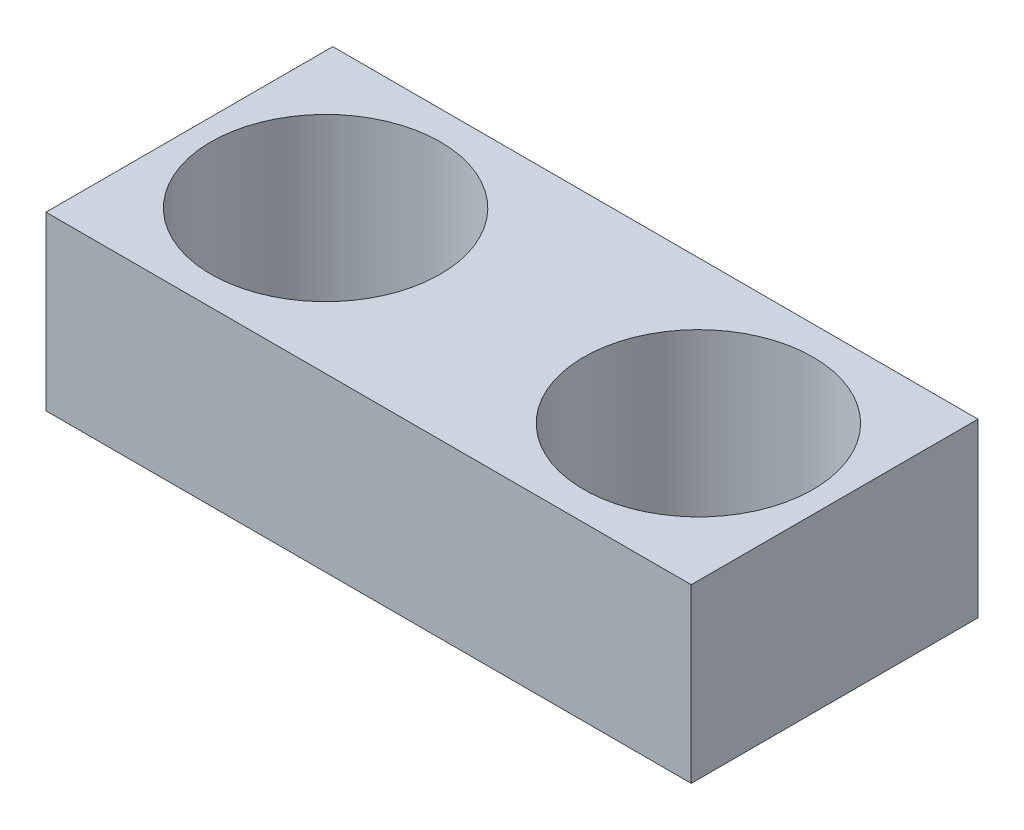
ISO-10303-21;
HEADER;
FILE_DESCRIPTION(('STEP AP214'),'2;1');
FILE_NAME('part.step','',(''),(''),'','','');
FILE_SCHEMA(('AUTOMOTIVE_DESIGN { 1 0 10303 214 1 1 1 1 }'));
ENDSEC;
DATA;
#1=APPLICATION_CONTEXT('core data for automotive mechanical design processes');
#2=APPLICATION_PROTOCOL_DEFINITION('international standard','automotive_design',2000,#1);
#3=PRODUCT_CONTEXT('',#1,'mechanical');
#4=PRODUCT('Part','Part','',(#3));
#5=PRODUCT_RELATED_PRODUCT_CATEGORY('part','',(#4));
#6=PRODUCT_DEFINITION_FORMATION('','',#4);
#7=PRODUCT_DEFINITION_CONTEXT('part definition',#1,'design');
#8=PRODUCT_DEFINITION('design','',#6,#7);
#9=PRODUCT_DEFINITION_SHAPE('','',#8);
#10=(LENGTH_UNIT() NAMED_UNIT(*) SI_UNIT(.MILLI.,.METRE.));
#11=(NAMED_UNIT(*) PLANE_ANGLE_UNIT() SI_UNIT($,.RADIAN.));
#12=(NAMED_UNIT(*) SI_UNIT($,.STERADIAN.) SOLID_ANGLE_UNIT());
#13=UNCERTAINTY_MEASURE_WITH_UNIT(LENGTH_MEASURE(1.E-05),#10,'distance_accuracy_value','');
#14=(GEOMETRIC_REPRESENTATION_CONTEXT(3) GLOBAL_UNCERTAINTY_ASSIGNED_CONTEXT((#13)) GLOBAL_UNIT_ASSIGNED_CONTEXT((#10,
#11,#12)) REPRESENTATION_CONTEXT('',''));
#15=CARTESIAN_POINT('',(0.,0.,0.));
#16=DIRECTION('',(0.,0.,1.));
#17=DIRECTION('',(1.,0.,0.));
#18=AXIS2_PLACEMENT_3D('',#15,#16,#17);
#19=CARTESIAN_POINT('',(0.,12.,-20.));
#20=DIRECTION('',(0.,0.,1.));
#21=DIRECTION('',(1.,0.,0.));
#22=AXIS2_PLACEMENT_3D('',#19,#20,#21);
#23=PLANE('',#22);
#24=DIRECTION('',(0.,-1.,0.));
#25=VECTOR('',#24,1.);
#26=CARTESIAN_POINT('',(-26.3591663046625,4.,-20.));
#27=LINE('',#26,#25);
#28=CARTESIAN_POINT('',(-26.3591663046625,4.,-20.));
#29=VERTEX_POINT('',#28);
#30=CARTESIAN_POINT('',(-26.3591663046625,0.,-20.));
#31=VERTEX_POINT('',#30);
#32=EDGE_CURVE('E119',#29,#31,#27,.T.);
#33=ORIENTED_EDGE('',*,*,#32,.T.);
#34=DIRECTION('',(-1.,0.,0.));
#35=VECTOR('',#34,1.);
#36=CARTESIAN_POINT('',(0.,0.,-20.));
#37=LINE('',#36,#35);
#38=CARTESIAN_POINT('',(-45.,0.,-20.));
#39=VERTEX_POINT('',#38);
#40=EDGE_CURVE('E170',#31,#39,#37,.T.);
#41=ORIENTED_EDGE('',*,*,#40,.T.);
#42=DIRECTION('',(0.,-1.,0.));
#43=VECTOR('',#42,1.);
#44=CARTESIAN_POINT('',(-45.,12.,-20.));
#45=LINE('',#44,#43);
#46=CARTESIAN_POINT('',(-45.,12.,-20.));
#47=VERTEX_POINT('',#46);
#48=EDGE_CURVE('E175',#47,#39,#45,.T.);
#49=ORIENTED_EDGE('',*,*,#48,.F.);
#50=DIRECTION('',(-1.,0.,0.));
#51=VECTOR('',#50,1.);
#52=CARTESIAN_POINT('',(0.,12.,-20.));
#53=LINE('',#52,#51);
#54=CARTESIAN_POINT('',(0.,12.,-20.));
#55=VERTEX_POINT('',#54);
#56=EDGE_CURVE('E161',#55,#47,#53,.T.);
#57=ORIENTED_EDGE('',*,*,#56,.F.);
#58=DIRECTION('',(0.,-1.,0.));
#59=VECTOR('',#58,1.);
#60=CARTESIAN_POINT('',(0.,12.,-20.));
#61=LINE('',#60,#59);
#62=CARTESIAN_POINT('',(0.,0.,-20.));
#63=VERTEX_POINT('',#62);
#64=EDGE_CURVE('E43',#55,#63,#61,.T.);
#65=ORIENTED_EDGE('',*,*,#64,.T.);
#66=CARTESIAN_POINT('',(-18.1408336953375,0.,-20.));
#67=VERTEX_POINT('',#66);
#68=EDGE_CURVE('E171',#63,#67,#37,.T.);
#69=ORIENTED_EDGE('',*,*,#68,.T.);
#70=DIRECTION('',(0.,-1.,0.));
#71=VECTOR('',#70,1.);
#72=CARTESIAN_POINT('',(-18.1408336953375,4.,-20.));
#73=LINE('',#72,#71);
#74=CARTESIAN_POINT('',(-18.1408336953375,4.,-20.));
#75=VERTEX_POINT('',#74);
#76=EDGE_CURVE('E51',#75,#67,#73,.T.);
#77=ORIENTED_EDGE('',*,*,#76,.F.);
#78=DIRECTION('',(-1.,0.,0.));
#79=VECTOR('',#78,1.);
#80=CARTESIAN_POINT('',(-18.1408336953375,4.,-20.));
#81=LINE('',#80,#79);
#82=EDGE_CURVE('E112',#75,#29,#81,.T.);
#83=ORIENTED_EDGE('',*,*,#82,.T.);
#84=EDGE_LOOP('',(#33,#41,#49,#57,#65,#69,#77,#83));
#85=FACE_BOUND('',#84,.T.);
#86=ADVANCED_FACE('F34',(#85),#23,.F.);
#87=CARTESIAN_POINT('',(0.,0.,0.));
#88=DIRECTION('',(0.,-1.,0.));
#89=DIRECTION('',(0.,0.,-1.));
#90=AXIS2_PLACEMENT_3D('',#87,#88,#89);
#91=PLANE('',#90);
#92=CARTESIAN_POINT('',(-35.5,0.,-10.));
#93=DIRECTION('',(0.,-1.,0.));
#94=DIRECTION('',(0.,0.,-1.));
#95=AXIS2_PLACEMENT_3D('',#92,#93,#94);
#96=CIRCLE('',#95,8.);
#97=CARTESIAN_POINT('',(-35.5,0.,-18.));
#98=VERTEX_POINT('',#97);
#99=EDGE_CURVE('E125',#98,#98,#96,.T.);
#100=ORIENTED_EDGE('',*,*,#99,.F.);
#101=EDGE_LOOP('',(#100));
#102=FACE_BOUND('',#101,.T.);
#103=CARTESIAN_POINT('',(-9.49999999999999,0.,-10.));
#104=DIRECTION('',(0.,-1.,0.));
#105=DIRECTION('',(0.,0.,-1.));
#106=AXIS2_PLACEMENT_3D('',#103,#104,#105);
#107=CIRCLE('',#106,8.);
#108=CARTESIAN_POINT('',(-9.49999999999999,0.,-18.));
#109=VERTEX_POINT('',#108);
#110=EDGE_CURVE('E147',#109,#109,#107,.T.);
#111=ORIENTED_EDGE('',*,*,#110,.F.);
#112=EDGE_LOOP('',(#111));
#113=FACE_BOUND('',#112,.T.);
#114=ORIENTED_EDGE('',*,*,#40,.F.);
#115=CARTESIAN_POINT('',(-25.7364011918417,0.,-17.7081266805629));
#116=DIRECTION('',(0.,1.,0.));
#117=DIRECTION('',(0.,0.,1.));
#118=AXIS2_PLACEMENT_3D('',#115,#116,#117);
#119=CIRCLE('',#118,2.37497783107425);
#120=CARTESIAN_POINT('',(-26.6108703226178,0.,-15.5));
#121=VERTEX_POINT('',#120);
#122=EDGE_CURVE('E122',#31,#121,#119,.T.);
#123=ORIENTED_EDGE('',*,*,#122,.T.);
#124=DIRECTION('',(-1.,0.,0.));
#125=VECTOR('',#124,1.);
#126=CARTESIAN_POINT('',(-18.1408336953375,0.,-15.5));
#127=LINE('',#126,#125);
#128=CARTESIAN_POINT('',(-18.1408336953375,0.,-15.5));
#129=VERTEX_POINT('',#128);
#130=EDGE_CURVE('E131',#129,#121,#127,.T.);
#131=ORIENTED_EDGE('',*,*,#130,.F.);
#132=CARTESIAN_POINT('',(-18.9465150061825,0.,-17.75));
#133=DIRECTION('',(0.,-1.,0.));
#134=DIRECTION('',(0.,0.,-1.));
#135=AXIS2_PLACEMENT_3D('',#132,#133,#134);
#136=CIRCLE('',#135,2.38990007628876);
#137=EDGE_CURVE('E129',#67,#129,#136,.T.);
#138=ORIENTED_EDGE('',*,*,#137,.F.);
#139=ORIENTED_EDGE('',*,*,#68,.F.);
#140=DIRECTION('',(0.,0.,-1.));
#141=VECTOR('',#140,1.);
#142=CARTESIAN_POINT('',(0.,0.,0.));
#143=LINE('',#142,#141);
#144=CARTESIAN_POINT('',(0.,0.,0.));
#145=VERTEX_POINT('',#144);
#146=EDGE_CURVE('E159',#145,#63,#143,.T.);
#147=ORIENTED_EDGE('',*,*,#146,.F.);
#148=DIRECTION('',(-1.,0.,0.));
#149=VECTOR('',#148,1.);
#150=CARTESIAN_POINT('',(0.,0.,0.));
#151=LINE('',#150,#149);
#152=CARTESIAN_POINT('',(-45.,0.,0.));
#153=VERTEX_POINT('',#152);
#154=EDGE_CURVE('E153',#145,#153,#151,.T.);
#155=ORIENTED_EDGE('',*,*,#154,.T.);
#156=DIRECTION('',(0.,0.,-1.));
#157=VECTOR('',#156,1.);
#158=CARTESIAN_POINT('',(-45.,0.,0.));
#159=LINE('',#158,#157);
#160=EDGE_CURVE('E167',#153,#39,#159,.T.);
#161=ORIENTED_EDGE('',*,*,#160,.T.);
#162=EDGE_LOOP('',(#114,#123,#131,#138,#139,#147,#155,#161));
#163=FACE_BOUND('',#162,.T.);
#164=ADVANCED_FACE('F181',(#102,#113,#163),#91,.T.);
#165=CARTESIAN_POINT('',(0.,12.,0.));
#166=DIRECTION('',(0.,0.,1.));
#167=DIRECTION('',(1.,0.,0.));
#168=AXIS2_PLACEMENT_3D('',#165,#166,#167);
#169=PLANE('',#168);
#170=ORIENTED_EDGE('',*,*,#154,.F.);
#171=DIRECTION('',(0.,-1.,0.));
#172=VECTOR('',#171,1.);
#173=CARTESIAN_POINT('',(0.,12.,0.));
#174=LINE('',#173,#172);
#175=CARTESIAN_POINT('',(0.,12.,0.));
#176=VERTEX_POINT('',#175);
#177=EDGE_CURVE('E11',#176,#145,#174,.T.);
#178=ORIENTED_EDGE('',*,*,#177,.F.);
#179=DIRECTION('',(-1.,0.,0.));
#180=VECTOR('',#179,1.);
#181=CARTESIAN_POINT('',(0.,12.,0.));
#182=LINE('',#181,#180);
#183=CARTESIAN_POINT('',(-45.,12.,0.));
#184=VERTEX_POINT('',#183);
#185=EDGE_CURVE('E156',#176,#184,#182,.T.);
#186=ORIENTED_EDGE('',*,*,#185,.T.);
#187=DIRECTION('',(0.,-1.,0.));
#188=VECTOR('',#187,1.);
#189=CARTESIAN_POINT('',(-45.,12.,0.));
#190=LINE('',#189,#188);
#191=EDGE_CURVE('E38',#184,#153,#190,.T.);
#192=ORIENTED_EDGE('',*,*,#191,.T.);
#193=EDGE_LOOP('',(#170,#178,#186,#192));
#194=FACE_BOUND('',#193,.T.);
#195=ADVANCED_FACE('F36',(#194),#169,.T.);
#196=CARTESIAN_POINT('',(0.,12.,0.));
#197=DIRECTION('',(-1.,0.,0.));
#198=DIRECTION('',(0.,0.,1.));
#199=AXIS2_PLACEMENT_3D('',#196,#197,#198);
#200=PLANE('',#199);
#201=ORIENTED_EDGE('',*,*,#146,.T.);
#202=ORIENTED_EDGE('',*,*,#64,.F.);
#203=DIRECTION('',(0.,0.,-1.));
#204=VECTOR('',#203,1.);
#205=CARTESIAN_POINT('',(0.,12.,0.));
#206=LINE('',#205,#204);
#207=EDGE_CURVE('E163',#176,#55,#206,.T.);
#208=ORIENTED_EDGE('',*,*,#207,.F.);
#209=ORIENTED_EDGE('',*,*,#177,.T.);
#210=EDGE_LOOP('',(#201,#202,#208,#209));
#211=FACE_BOUND('',#210,.T.);
#212=ADVANCED_FACE('F184',(#211),#200,.F.);
#213=CARTESIAN_POINT('',(-45.,12.,0.));
#214=DIRECTION('',(-1.,0.,0.));
#215=DIRECTION('',(0.,0.,1.));
#216=AXIS2_PLACEMENT_3D('',#213,#214,#215);
#217=PLANE('',#216);
#218=ORIENTED_EDGE('',*,*,#160,.F.);
#219=ORIENTED_EDGE('',*,*,#191,.F.);
#220=DIRECTION('',(0.,0.,-1.));
#221=VECTOR('',#220,1.);
#222=CARTESIAN_POINT('',(-45.,12.,0.));
#223=LINE('',#222,#221);
#224=EDGE_CURVE('E158',#184,#47,#223,.T.);
#225=ORIENTED_EDGE('',*,*,#224,.T.);
#226=ORIENTED_EDGE('',*,*,#48,.T.);
#227=EDGE_LOOP('',(#218,#219,#225,#226));
#228=FACE_BOUND('',#227,.T.);
#229=ADVANCED_FACE('F179',(#228),#217,.T.);
#230=CARTESIAN_POINT('',(0.,12.,0.));
#231=DIRECTION('',(0.,-1.,0.));
#232=DIRECTION('',(0.,0.,-1.));
#233=AXIS2_PLACEMENT_3D('',#230,#231,#232);
#234=PLANE('',#233);
#235=CARTESIAN_POINT('',(-35.5,12.,-10.));
#236=DIRECTION('',(0.,-1.,0.));
#237=DIRECTION('',(0.,0.,-1.));
#238=AXIS2_PLACEMENT_3D('',#235,#236,#237);
#239=CIRCLE('',#238,8.);
#240=CARTESIAN_POINT('',(-35.5,12.,-18.));
#241=VERTEX_POINT('',#240);
#242=EDGE_CURVE('E144',#241,#241,#239,.T.);
#243=ORIENTED_EDGE('',*,*,#242,.T.);
#244=EDGE_LOOP('',(#243));
#245=FACE_BOUND('',#244,.T.);
#246=CARTESIAN_POINT('',(-9.49999999999999,12.,-10.));
#247=DIRECTION('',(0.,-1.,0.));
#248=DIRECTION('',(0.,0.,-1.));
#249=AXIS2_PLACEMENT_3D('',#246,#247,#248);
#250=CIRCLE('',#249,8.);
#251=CARTESIAN_POINT('',(-9.49999999999999,12.,-18.));
#252=VERTEX_POINT('',#251);
#253=EDGE_CURVE('E150',#252,#252,#250,.T.);
#254=ORIENTED_EDGE('',*,*,#253,.T.);
#255=EDGE_LOOP('',(#254));
#256=FACE_BOUND('',#255,.T.);
#257=ORIENTED_EDGE('',*,*,#185,.F.);
#258=ORIENTED_EDGE('',*,*,#207,.T.);
#259=ORIENTED_EDGE('',*,*,#56,.T.);
#260=ORIENTED_EDGE('',*,*,#224,.F.);
#261=EDGE_LOOP('',(#257,#258,#259,#260));
#262=FACE_BOUND('',#261,.T.);
#263=ADVANCED_FACE('F187',(#245,#256,#262),#234,.F.);
#264=CARTESIAN_POINT('',(-9.49999999999999,12.,-10.));
#265=DIRECTION('',(0.,-1.,0.));
#266=DIRECTION('',(0.,0.,-1.));
#267=AXIS2_PLACEMENT_3D('',#264,#265,#266);
#268=CYLINDRICAL_SURFACE('',#267,8.);
#269=ORIENTED_EDGE('',*,*,#253,.F.);
#270=EDGE_LOOP('',(#269));
#271=FACE_BOUND('',#270,.T.);
#272=ORIENTED_EDGE('',*,*,#110,.T.);
#273=EDGE_LOOP('',(#272));
#274=FACE_BOUND('',#273,.T.);
#275=ADVANCED_FACE('F189',(#271,#274),#268,.F.);
#276=CARTESIAN_POINT('',(-35.5,12.,-10.));
#277=DIRECTION('',(0.,-1.,0.));
#278=DIRECTION('',(0.,0.,-1.));
#279=AXIS2_PLACEMENT_3D('',#276,#277,#278);
#280=CYLINDRICAL_SURFACE('',#279,8.);
#281=ORIENTED_EDGE('',*,*,#242,.F.);
#282=EDGE_LOOP('',(#281));
#283=FACE_BOUND('',#282,.T.);
#284=ORIENTED_EDGE('',*,*,#99,.T.);
#285=EDGE_LOOP('',(#284));
#286=FACE_BOUND('',#285,.T.);
#287=ADVANCED_FACE('F196',(#283,#286),#280,.F.);
#288=CARTESIAN_POINT('',(-25.7364011918417,4.,-17.7081266805629));
#289=DIRECTION('',(0.,-1.,0.));
#290=DIRECTION('',(0.,0.,-1.));
#291=AXIS2_PLACEMENT_3D('',#288,#289,#290);
#292=CYLINDRICAL_SURFACE('',#291,2.37497783107425);
#293=ORIENTED_EDGE('',*,*,#122,.F.);
#294=ORIENTED_EDGE('',*,*,#32,.F.);
#295=CARTESIAN_POINT('',(-25.7364011918417,4.,-17.7081266805629));
#296=DIRECTION('',(0.,1.,0.));
#297=DIRECTION('',(0.,0.,1.));
#298=AXIS2_PLACEMENT_3D('',#295,#296,#297);
#299=CIRCLE('',#298,2.37497783107425);
#300=CARTESIAN_POINT('',(-26.6108703226178,4.,-15.5));
#301=VERTEX_POINT('',#300);
#302=EDGE_CURVE('E107',#29,#301,#299,.T.);
#303=ORIENTED_EDGE('',*,*,#302,.T.);
#304=DIRECTION('',(0.,-1.,0.));
#305=VECTOR('',#304,1.);
#306=CARTESIAN_POINT('',(-26.6108703226178,4.,-15.5));
#307=LINE('',#306,#305);
#308=EDGE_CURVE('E126',#301,#121,#307,.T.);
#309=ORIENTED_EDGE('',*,*,#308,.T.);
#310=EDGE_LOOP('',(#293,#294,#303,#309));
#311=FACE_BOUND('',#310,.T.);
#312=ADVANCED_FACE('F120',(#311),#292,.F.);
#313=CARTESIAN_POINT('',(-18.1408336953375,4.,-15.5));
#314=DIRECTION('',(0.,0.,1.));
#315=DIRECTION('',(1.,0.,0.));
#316=AXIS2_PLACEMENT_3D('',#313,#314,#315);
#317=PLANE('',#316);
#318=ORIENTED_EDGE('',*,*,#130,.T.);
#319=ORIENTED_EDGE('',*,*,#308,.F.);
#320=DIRECTION('',(-1.,0.,0.));
#321=VECTOR('',#320,1.);
#322=CARTESIAN_POINT('',(-18.1408336953375,4.,-15.5));
#323=LINE('',#322,#321);
#324=CARTESIAN_POINT('',(-18.1408336953375,4.,-15.5));
#325=VERTEX_POINT('',#324);
#326=EDGE_CURVE('E114',#325,#301,#323,.T.);
#327=ORIENTED_EDGE('',*,*,#326,.F.);
#328=DIRECTION('',(0.,-1.,0.));
#329=VECTOR('',#328,1.);
#330=CARTESIAN_POINT('',(-18.1408336953375,4.,-15.5));
#331=LINE('',#330,#329);
#332=EDGE_CURVE('E141',#325,#129,#331,.T.);
#333=ORIENTED_EDGE('',*,*,#332,.T.);
#334=EDGE_LOOP('',(#318,#319,#327,#333));
#335=FACE_BOUND('',#334,.T.);
#336=ADVANCED_FACE('F231',(#335),#317,.F.);
#337=CARTESIAN_POINT('',(-18.9465150061825,4.,-17.75));
#338=DIRECTION('',(0.,-1.,0.));
#339=DIRECTION('',(0.,0.,-1.));
#340=AXIS2_PLACEMENT_3D('',#337,#338,#339);
#341=CYLINDRICAL_SURFACE('',#340,2.38990007628876);
#342=ORIENTED_EDGE('',*,*,#137,.T.);
#343=ORIENTED_EDGE('',*,*,#332,.F.);
#344=CARTESIAN_POINT('',(-18.9465150061825,4.,-17.75));
#345=DIRECTION('',(0.,-1.,0.));
#346=DIRECTION('',(0.,0.,-1.));
#347=AXIS2_PLACEMENT_3D('',#344,#345,#346);
#348=CIRCLE('',#347,2.38990007628876);
#349=EDGE_CURVE('E135',#75,#325,#348,.T.);
#350=ORIENTED_EDGE('',*,*,#349,.F.);
#351=ORIENTED_EDGE('',*,*,#76,.T.);
#352=EDGE_LOOP('',(#342,#343,#350,#351));
#353=FACE_BOUND('',#352,.T.);
#354=ADVANCED_FACE('F241',(#353),#341,.F.);
#355=CARTESIAN_POINT('',(-25.7364011918417,4.,-17.7081266805629));
#356=DIRECTION('',(0.,1.,0.));
#357=DIRECTION('',(0.,0.,1.));
#358=AXIS2_PLACEMENT_3D('',#355,#356,#357);
#359=PLANE('',#358);
#360=ORIENTED_EDGE('',*,*,#82,.F.);
#361=ORIENTED_EDGE('',*,*,#349,.T.);
#362=ORIENTED_EDGE('',*,*,#326,.T.);
#363=ORIENTED_EDGE('',*,*,#302,.F.);
#364=EDGE_LOOP('',(#360,#361,#362,#363));
#365=FACE_BOUND('',#364,.T.);
#366=ADVANCED_FACE('F109',(#365),#359,.F.);
#367=CLOSED_SHELL('',(#86,#164,#195,#212,#229,#263,#275,#287,#312,#336,#354,#366));
#368=MANIFOLD_SOLID_BREP('B2',#367);
#369=ADVANCED_BREP_SHAPE_REPRESENTATION('',(#18,#368),#14);
#370=SHAPE_DEFINITION_REPRESENTATION(#9,#369);
ENDSEC;
END-ISO-10303-21;
